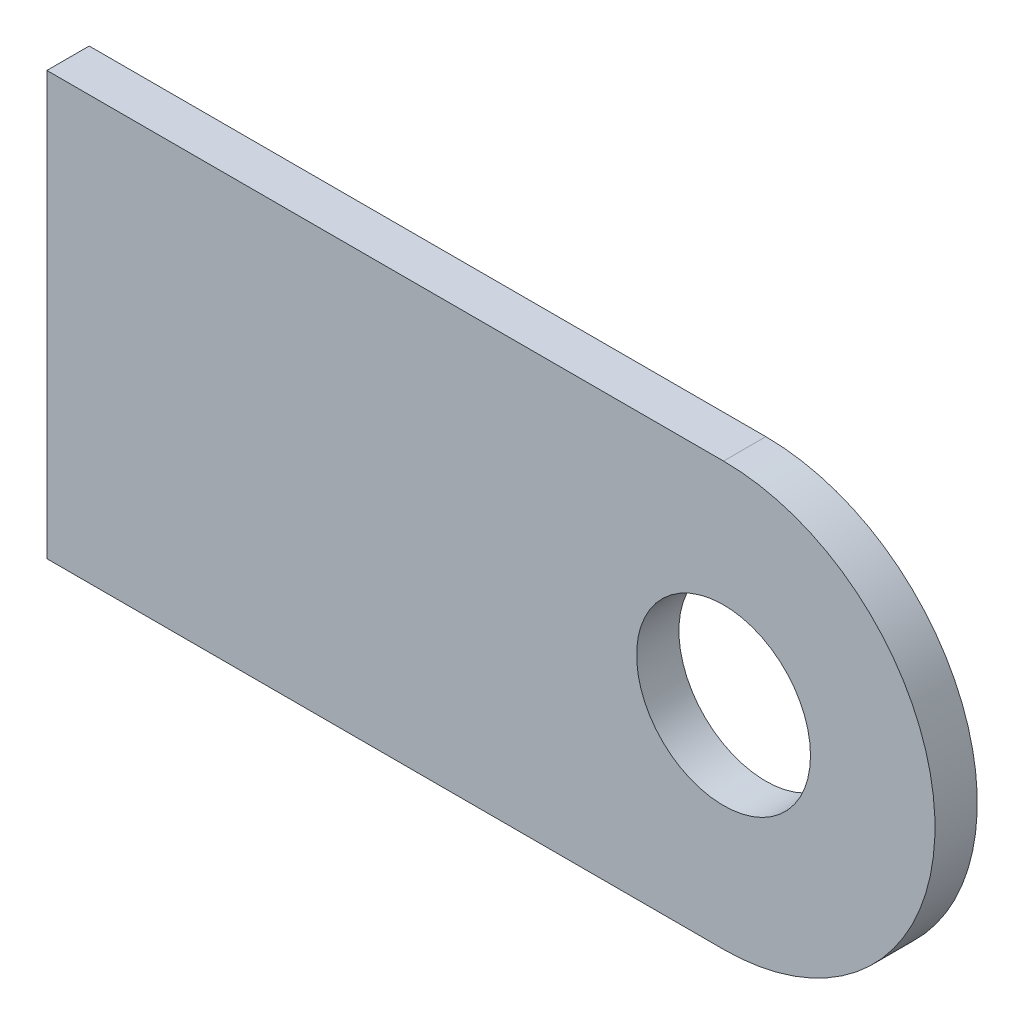
ISO-10303-21;
HEADER;
FILE_DESCRIPTION(('STEP AP214'),'2;1');
FILE_NAME('part.step','',(''),(''),'','','');
FILE_SCHEMA(('AUTOMOTIVE_DESIGN { 1 0 10303 214 1 1 1 1 }'));
ENDSEC;
DATA;
#1=APPLICATION_CONTEXT('core data for automotive mechanical design processes');
#2=APPLICATION_PROTOCOL_DEFINITION('international standard','automotive_design',2000,#1);
#3=PRODUCT_CONTEXT('',#1,'mechanical');
#4=PRODUCT('Part','Part','',(#3));
#5=PRODUCT_RELATED_PRODUCT_CATEGORY('part','',(#4));
#6=PRODUCT_DEFINITION_FORMATION('','',#4);
#7=PRODUCT_DEFINITION_CONTEXT('part definition',#1,'design');
#8=PRODUCT_DEFINITION('design','',#6,#7);
#9=PRODUCT_DEFINITION_SHAPE('','',#8);
#10=(LENGTH_UNIT() NAMED_UNIT(*) SI_UNIT(.MILLI.,.METRE.));
#11=(NAMED_UNIT(*) PLANE_ANGLE_UNIT() SI_UNIT($,.RADIAN.));
#12=(NAMED_UNIT(*) SI_UNIT($,.STERADIAN.) SOLID_ANGLE_UNIT());
#13=UNCERTAINTY_MEASURE_WITH_UNIT(LENGTH_MEASURE(1.E-05),#10,'distance_accuracy_value','');
#14=(GEOMETRIC_REPRESENTATION_CONTEXT(3) GLOBAL_UNCERTAINTY_ASSIGNED_CONTEXT((#13)) GLOBAL_UNIT_ASSIGNED_CONTEXT((#10,
#11,#12)) REPRESENTATION_CONTEXT('',''));
#15=CARTESIAN_POINT('',(0.,0.,0.));
#16=DIRECTION('',(0.,0.,1.));
#17=DIRECTION('',(1.,0.,0.));
#18=AXIS2_PLACEMENT_3D('',#15,#16,#17);
#19=CARTESIAN_POINT('',(25.4,7.93749999999999,1.5875));
#20=DIRECTION('',(0.,0.,-1.));
#21=DIRECTION('',(-1.,0.,0.));
#22=AXIS2_PLACEMENT_3D('',#19,#20,#21);
#23=PLANE('',#22);
#24=DIRECTION('',(0.,-1.,0.));
#25=VECTOR('',#24,1.);
#26=CARTESIAN_POINT('',(0.,0.,1.5875));
#27=LINE('',#26,#25);
#28=CARTESIAN_POINT('',(0.,15.875,1.5875));
#29=VERTEX_POINT('',#28);
#30=CARTESIAN_POINT('',(0.,0.,1.5875));
#31=VERTEX_POINT('',#30);
#32=EDGE_CURVE('E97',#29,#31,#27,.T.);
#33=ORIENTED_EDGE('',*,*,#32,.T.);
#34=DIRECTION('',(1.,0.,0.));
#35=VECTOR('',#34,1.);
#36=CARTESIAN_POINT('',(25.4,0.,1.5875));
#37=LINE('',#36,#35);
#38=CARTESIAN_POINT('',(25.4,0.,1.5875));
#39=VERTEX_POINT('',#38);
#40=EDGE_CURVE('E92',#31,#39,#37,.T.);
#41=ORIENTED_EDGE('',*,*,#40,.T.);
#42=CARTESIAN_POINT('',(25.4,7.93749999999999,1.5875));
#43=DIRECTION('',(0.,0.,1.));
#44=DIRECTION('',(-1.,0.,0.));
#45=AXIS2_PLACEMENT_3D('',#42,#43,#44);
#46=CIRCLE('',#45,7.9375);
#47=CARTESIAN_POINT('',(25.4,15.875,1.5875));
#48=VERTEX_POINT('',#47);
#49=EDGE_CURVE('E95',#39,#48,#46,.T.);
#50=ORIENTED_EDGE('',*,*,#49,.T.);
#51=DIRECTION('',(-1.,0.,0.));
#52=VECTOR('',#51,1.);
#53=CARTESIAN_POINT('',(0.,15.875,1.5875));
#54=LINE('',#53,#52);
#55=EDGE_CURVE('E62',#48,#29,#54,.T.);
#56=ORIENTED_EDGE('',*,*,#55,.T.);
#57=EDGE_LOOP('',(#33,#41,#50,#56));
#58=FACE_BOUND('',#57,.T.);
#59=CARTESIAN_POINT('',(25.4,7.93749999999999,1.5875));
#60=DIRECTION('',(0.,0.,1.));
#61=DIRECTION('',(1.,0.,0.));
#62=AXIS2_PLACEMENT_3D('',#59,#60,#61);
#63=CIRCLE('',#62,3.26389999999999);
#64=CARTESIAN_POINT('',(28.6639,7.93749999999999,1.5875));
#65=VERTEX_POINT('',#64);
#66=EDGE_CURVE('E117',#65,#65,#63,.T.);
#67=ORIENTED_EDGE('',*,*,#66,.F.);
#68=EDGE_LOOP('',(#67));
#69=FACE_BOUND('',#68,.T.);
#70=ADVANCED_FACE('F44',(#58,#69),#23,.F.);
#71=CARTESIAN_POINT('',(25.4,7.93749999999999,0.));
#72=DIRECTION('',(0.,0.,-1.));
#73=DIRECTION('',(-1.,0.,0.));
#74=AXIS2_PLACEMENT_3D('',#71,#72,#73);
#75=PLANE('',#74);
#76=DIRECTION('',(0.,-1.,0.));
#77=VECTOR('',#76,1.);
#78=CARTESIAN_POINT('',(0.,0.,0.));
#79=LINE('',#78,#77);
#80=CARTESIAN_POINT('',(0.,15.875,0.));
#81=VERTEX_POINT('',#80);
#82=CARTESIAN_POINT('',(0.,0.,0.));
#83=VERTEX_POINT('',#82);
#84=EDGE_CURVE('E113',#81,#83,#79,.T.);
#85=ORIENTED_EDGE('',*,*,#84,.F.);
#86=DIRECTION('',(-1.,0.,0.));
#87=VECTOR('',#86,1.);
#88=CARTESIAN_POINT('',(0.,15.875,0.));
#89=LINE('',#88,#87);
#90=CARTESIAN_POINT('',(25.4,15.875,0.));
#91=VERTEX_POINT('',#90);
#92=EDGE_CURVE('E85',#91,#81,#89,.T.);
#93=ORIENTED_EDGE('',*,*,#92,.F.);
#94=CARTESIAN_POINT('',(25.4,7.93749999999999,0.));
#95=DIRECTION('',(0.,0.,1.));
#96=DIRECTION('',(-1.,0.,0.));
#97=AXIS2_PLACEMENT_3D('',#94,#95,#96);
#98=CIRCLE('',#97,7.9375);
#99=CARTESIAN_POINT('',(25.4,0.,0.));
#100=VERTEX_POINT('',#99);
#101=EDGE_CURVE('E79',#100,#91,#98,.T.);
#102=ORIENTED_EDGE('',*,*,#101,.F.);
#103=DIRECTION('',(1.,0.,0.));
#104=VECTOR('',#103,1.);
#105=CARTESIAN_POINT('',(25.4,0.,0.));
#106=LINE('',#105,#104);
#107=EDGE_CURVE('E102',#83,#100,#106,.T.);
#108=ORIENTED_EDGE('',*,*,#107,.F.);
#109=EDGE_LOOP('',(#85,#93,#102,#108));
#110=FACE_BOUND('',#109,.T.);
#111=CARTESIAN_POINT('',(25.4,7.93749999999999,0.));
#112=DIRECTION('',(0.,0.,1.));
#113=DIRECTION('',(1.,0.,0.));
#114=AXIS2_PLACEMENT_3D('',#111,#112,#113);
#115=CIRCLE('',#114,3.26389999999999);
#116=CARTESIAN_POINT('',(28.6639,7.93749999999999,0.));
#117=VERTEX_POINT('',#116);
#118=EDGE_CURVE('E135',#117,#117,#115,.T.);
#119=ORIENTED_EDGE('',*,*,#118,.T.);
#120=EDGE_LOOP('',(#119));
#121=FACE_BOUND('',#120,.T.);
#122=ADVANCED_FACE('F130',(#110,#121),#75,.T.);
#123=CARTESIAN_POINT('',(0.,0.,1.5875));
#124=DIRECTION('',(1.,0.,0.));
#125=DIRECTION('',(0.,0.,-1.));
#126=AXIS2_PLACEMENT_3D('',#123,#124,#125);
#127=PLANE('',#126);
#128=ORIENTED_EDGE('',*,*,#84,.T.);
#129=DIRECTION('',(0.,0.,-1.));
#130=VECTOR('',#129,1.);
#131=CARTESIAN_POINT('',(0.,0.,1.5875));
#132=LINE('',#131,#130);
#133=EDGE_CURVE('E11',#31,#83,#132,.T.);
#134=ORIENTED_EDGE('',*,*,#133,.F.);
#135=ORIENTED_EDGE('',*,*,#32,.F.);
#136=DIRECTION('',(0.,0.,-1.));
#137=VECTOR('',#136,1.);
#138=CARTESIAN_POINT('',(0.,15.875,1.5875));
#139=LINE('',#138,#137);
#140=EDGE_CURVE('E109',#29,#81,#139,.T.);
#141=ORIENTED_EDGE('',*,*,#140,.T.);
#142=EDGE_LOOP('',(#128,#134,#135,#141));
#143=FACE_BOUND('',#142,.T.);
#144=ADVANCED_FACE('F46',(#143),#127,.F.);
#145=CARTESIAN_POINT('',(25.4,0.,1.5875));
#146=DIRECTION('',(0.,1.,0.));
#147=DIRECTION('',(0.,0.,1.));
#148=AXIS2_PLACEMENT_3D('',#145,#146,#147);
#149=PLANE('',#148);
#150=ORIENTED_EDGE('',*,*,#107,.T.);
#151=DIRECTION('',(0.,0.,-1.));
#152=VECTOR('',#151,1.);
#153=CARTESIAN_POINT('',(25.4,0.,1.5875));
#154=LINE('',#153,#152);
#155=EDGE_CURVE('E54',#39,#100,#154,.T.);
#156=ORIENTED_EDGE('',*,*,#155,.F.);
#157=ORIENTED_EDGE('',*,*,#40,.F.);
#158=ORIENTED_EDGE('',*,*,#133,.T.);
#159=EDGE_LOOP('',(#150,#156,#157,#158));
#160=FACE_BOUND('',#159,.T.);
#161=ADVANCED_FACE('F101',(#160),#149,.F.);
#162=CARTESIAN_POINT('',(25.4,7.93749999999999,1.5875));
#163=DIRECTION('',(0.,0.,-1.));
#164=DIRECTION('',(-1.,0.,0.));
#165=AXIS2_PLACEMENT_3D('',#162,#163,#164);
#166=CYLINDRICAL_SURFACE('',#165,7.9375);
#167=ORIENTED_EDGE('',*,*,#101,.T.);
#168=DIRECTION('',(0.,0.,-1.));
#169=VECTOR('',#168,1.);
#170=CARTESIAN_POINT('',(25.4,15.875,1.5875));
#171=LINE('',#170,#169);
#172=EDGE_CURVE('E104',#48,#91,#171,.T.);
#173=ORIENTED_EDGE('',*,*,#172,.F.);
#174=ORIENTED_EDGE('',*,*,#49,.F.);
#175=ORIENTED_EDGE('',*,*,#155,.T.);
#176=EDGE_LOOP('',(#167,#173,#174,#175));
#177=FACE_BOUND('',#176,.T.);
#178=ADVANCED_FACE('F105',(#177),#166,.T.);
#179=CARTESIAN_POINT('',(0.,15.875,1.5875));
#180=DIRECTION('',(0.,-1.,0.));
#181=DIRECTION('',(0.,0.,-1.));
#182=AXIS2_PLACEMENT_3D('',#179,#180,#181);
#183=PLANE('',#182);
#184=ORIENTED_EDGE('',*,*,#92,.T.);
#185=ORIENTED_EDGE('',*,*,#140,.F.);
#186=ORIENTED_EDGE('',*,*,#55,.F.);
#187=ORIENTED_EDGE('',*,*,#172,.T.);
#188=EDGE_LOOP('',(#184,#185,#186,#187));
#189=FACE_BOUND('',#188,.T.);
#190=ADVANCED_FACE('F127',(#189),#183,.F.);
#191=CARTESIAN_POINT('',(25.4,7.93749999999999,1.5875));
#192=DIRECTION('',(0.,0.,-1.));
#193=DIRECTION('',(-1.,0.,0.));
#194=AXIS2_PLACEMENT_3D('',#191,#192,#193);
#195=CYLINDRICAL_SURFACE('',#194,3.26389999999999);
#196=ORIENTED_EDGE('',*,*,#66,.T.);
#197=EDGE_LOOP('',(#196));
#198=FACE_BOUND('',#197,.T.);
#199=ORIENTED_EDGE('',*,*,#118,.F.);
#200=EDGE_LOOP('',(#199));
#201=FACE_BOUND('',#200,.T.);
#202=ADVANCED_FACE('F143',(#198,#201),#195,.F.);
#203=CLOSED_SHELL('',(#70,#122,#144,#161,#178,#190,#202));
#204=MANIFOLD_SOLID_BREP('B2',#203);
#205=ADVANCED_BREP_SHAPE_REPRESENTATION('',(#18,#204),#14);
#206=SHAPE_DEFINITION_REPRESENTATION(#9,#205);
ENDSEC;
END-ISO-10303-21;
